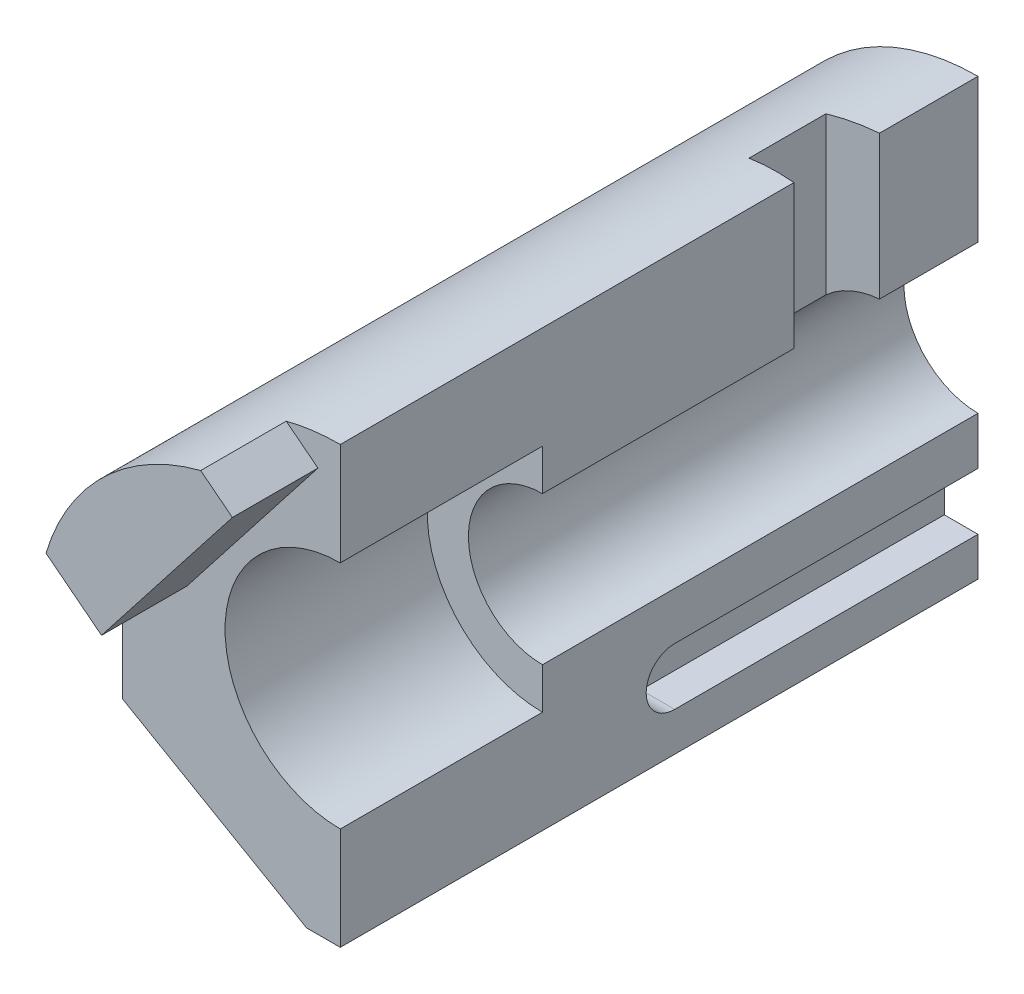
ISO-10303-21;
HEADER;
FILE_DESCRIPTION(('STEP AP214'),'2;1');
FILE_NAME('part.step','',(''),(''),'','','');
FILE_SCHEMA(('AUTOMOTIVE_DESIGN { 1 0 10303 214 1 1 1 1 }'));
ENDSEC;
DATA;
#1=APPLICATION_CONTEXT('core data for automotive mechanical design processes');
#2=APPLICATION_PROTOCOL_DEFINITION('international standard','automotive_design',2000,#1);
#3=PRODUCT_CONTEXT('',#1,'mechanical');
#4=PRODUCT('Part','Part','',(#3));
#5=PRODUCT_RELATED_PRODUCT_CATEGORY('part','',(#4));
#6=PRODUCT_DEFINITION_FORMATION('','',#4);
#7=PRODUCT_DEFINITION_CONTEXT('part definition',#1,'design');
#8=PRODUCT_DEFINITION('design','',#6,#7);
#9=PRODUCT_DEFINITION_SHAPE('','',#8);
#10=(LENGTH_UNIT() NAMED_UNIT(*) SI_UNIT(.MILLI.,.METRE.));
#11=(NAMED_UNIT(*) PLANE_ANGLE_UNIT() SI_UNIT($,.RADIAN.));
#12=(NAMED_UNIT(*) SI_UNIT($,.STERADIAN.) SOLID_ANGLE_UNIT());
#13=UNCERTAINTY_MEASURE_WITH_UNIT(LENGTH_MEASURE(1.E-05),#10,'distance_accuracy_value','');
#14=(GEOMETRIC_REPRESENTATION_CONTEXT(3) GLOBAL_UNCERTAINTY_ASSIGNED_CONTEXT((#13)) GLOBAL_UNIT_ASSIGNED_CONTEXT((#10,
#11,#12)) REPRESENTATION_CONTEXT('',''));
#15=CARTESIAN_POINT('',(0.,0.,0.));
#16=DIRECTION('',(0.,0.,1.));
#17=DIRECTION('',(1.,0.,0.));
#18=AXIS2_PLACEMENT_3D('',#15,#16,#17);
#19=CARTESIAN_POINT('',(0.,84.,-246.));
#20=DIRECTION('',(1.,0.,0.));
#21=DIRECTION('',(0.,1.,0.));
#22=AXIS2_PLACEMENT_3D('',#19,#20,#21);
#23=PLANE('',#22);
#24=DIRECTION('',(0.,1.,0.));
#25=VECTOR('',#24,1.);
#26=CARTESIAN_POINT('',(0.,-84.001,-175.));
#27=LINE('',#26,#25);
#28=CARTESIAN_POINT('',(0.,28.575,-175.));
#29=VERTEX_POINT('',#28);
#30=CARTESIAN_POINT('',(0.,83.9999999999999,-175.));
#31=VERTEX_POINT('',#30);
#32=EDGE_CURVE('E195',#29,#31,#27,.T.);
#33=ORIENTED_EDGE('',*,*,#32,.T.);
#34=DIRECTION('',(0.,0.,1.));
#35=VECTOR('',#34,1.);
#36=CARTESIAN_POINT('',(0.,84.,-246.));
#37=LINE('',#36,#35);
#38=CARTESIAN_POINT('',(0.,84.,0.));
#39=VERTEX_POINT('',#38);
#40=EDGE_CURVE('E404',#31,#39,#37,.T.);
#41=ORIENTED_EDGE('',*,*,#40,.T.);
#42=DIRECTION('',(0.,1.,0.));
#43=VECTOR('',#42,1.);
#44=CARTESIAN_POINT('',(0.,84.,0.));
#45=LINE('',#44,#43);
#46=CARTESIAN_POINT('',(0.,44.45,0.));
#47=VERTEX_POINT('',#46);
#48=EDGE_CURVE('E331',#47,#39,#45,.T.);
#49=ORIENTED_EDGE('',*,*,#48,.F.);
#50=DIRECTION('',(0.,0.,1.));
#51=VECTOR('',#50,1.);
#52=CARTESIAN_POINT('',(0.,44.45,-78.));
#53=LINE('',#52,#51);
#54=CARTESIAN_POINT('',(0.,44.45,-78.));
#55=VERTEX_POINT('',#54);
#56=EDGE_CURVE('E322',#55,#47,#53,.T.);
#57=ORIENTED_EDGE('',*,*,#56,.F.);
#58=DIRECTION('',(0.,-1.,0.));
#59=VECTOR('',#58,1.);
#60=CARTESIAN_POINT('',(0.,44.45,-78.));
#61=LINE('',#60,#59);
#62=CARTESIAN_POINT('',(0.,28.575,-78.));
#63=VERTEX_POINT('',#62);
#64=EDGE_CURVE('E306',#55,#63,#61,.T.);
#65=ORIENTED_EDGE('',*,*,#64,.T.);
#66=DIRECTION('',(0.,0.,1.));
#67=VECTOR('',#66,1.);
#68=CARTESIAN_POINT('',(0.,28.575,-246.));
#69=LINE('',#68,#67);
#70=EDGE_CURVE('E362',#29,#63,#69,.T.);
#71=ORIENTED_EDGE('',*,*,#70,.F.);
#72=EDGE_LOOP('',(#33,#41,#49,#57,#65,#71));
#73=FACE_BOUND('',#72,.T.);
#74=ADVANCED_FACE('F43',(#73),#23,.T.);
#75=CARTESIAN_POINT('',(0.,0.,-246.));
#76=DIRECTION('',(0.,0.,1.));
#77=DIRECTION('',(1.,0.,0.));
#78=AXIS2_PLACEMENT_3D('',#75,#76,#77);
#79=CYLINDRICAL_SURFACE('',#78,28.575);
#80=CARTESIAN_POINT('',(0.,0.,-175.));
#81=DIRECTION('',(-0.0871557427476508,0.,0.996194698091746));
#82=DIRECTION('',(0.996194698091746,0.,0.0871557427476508));
#83=AXIS2_PLACEMENT_3D('',#80,#81,#82);
#84=ELLIPSE('',#83,28.6841518578011,28.575);
#85=CARTESIAN_POINT('',(-19.,21.3431634253219,-176.662284606992));
#86=VERTEX_POINT('',#85);
#87=EDGE_CURVE('E189',#86,#29,#84,.F.);
#88=ORIENTED_EDGE('',*,*,#87,.T.);
#89=ORIENTED_EDGE('',*,*,#70,.T.);
#90=CARTESIAN_POINT('',(0.,0.,-78.));
#91=DIRECTION('',(0.,0.,1.));
#92=DIRECTION('',(1.,0.,0.));
#93=AXIS2_PLACEMENT_3D('',#90,#91,#92);
#94=CIRCLE('',#93,28.575);
#95=CARTESIAN_POINT('',(0.,-28.575,-78.));
#96=VERTEX_POINT('',#95);
#97=EDGE_CURVE('E310',#63,#96,#94,.T.);
#98=ORIENTED_EDGE('',*,*,#97,.T.);
#99=DIRECTION('',(0.,0.,1.));
#100=VECTOR('',#99,1.);
#101=CARTESIAN_POINT('',(0.,-28.575,-246.));
#102=LINE('',#101,#100);
#103=CARTESIAN_POINT('',(0.,-28.575,-246.));
#104=VERTEX_POINT('',#103);
#105=EDGE_CURVE('E52',#104,#96,#102,.T.);
#106=ORIENTED_EDGE('',*,*,#105,.F.);
#107=CARTESIAN_POINT('',(0.,0.,-246.));
#108=DIRECTION('',(0.,0.,-1.));
#109=DIRECTION('',(1.,0.,0.));
#110=AXIS2_PLACEMENT_3D('',#107,#108,#109);
#111=CIRCLE('',#110,28.575);
#112=CARTESIAN_POINT('',(0.,28.575,-246.));
#113=VERTEX_POINT('',#112);
#114=EDGE_CURVE('E332',#104,#113,#111,.T.);
#115=ORIENTED_EDGE('',*,*,#114,.T.);
#116=CARTESIAN_POINT('',(0.,28.575,-208.));
#117=VERTEX_POINT('',#116);
#118=EDGE_CURVE('E405',#113,#117,#69,.T.);
#119=ORIENTED_EDGE('',*,*,#118,.T.);
#120=CARTESIAN_POINT('',(0.,0.,-208.));
#121=DIRECTION('',(-0.087155742747658,0.,-0.996194698091746));
#122=DIRECTION('',(-0.996194698091746,0.,0.087155742747658));
#123=AXIS2_PLACEMENT_3D('',#120,#121,#122);
#124=ELLIPSE('',#123,28.6841518578012,28.575);
#125=CARTESIAN_POINT('',(-19.,21.3431634253219,-206.337715393007));
#126=VERTEX_POINT('',#125);
#127=EDGE_CURVE('E59',#117,#126,#124,.F.);
#128=ORIENTED_EDGE('',*,*,#127,.T.);
#129=DIRECTION('',(0.,0.,1.));
#130=VECTOR('',#129,1.);
#131=CARTESIAN_POINT('',(-19.,21.3431634253219,-246.));
#132=LINE('',#131,#130);
#133=EDGE_CURVE('E204',#126,#86,#132,.T.);
#134=ORIENTED_EDGE('',*,*,#133,.T.);
#135=EDGE_LOOP('',(#88,#89,#98,#106,#115,#119,#128,#134));
#136=FACE_BOUND('',#135,.T.);
#137=ADVANCED_FACE('F45',(#136),#79,.F.);
#138=CARTESIAN_POINT('',(0.,-28.575,-246.));
#139=DIRECTION('',(1.,0.,0.));
#140=DIRECTION('',(0.,1.,0.));
#141=AXIS2_PLACEMENT_3D('',#138,#139,#140);
#142=PLANE('',#141);
#143=DIRECTION('',(0.,0.,-1.));
#144=VECTOR('',#143,1.);
#145=CARTESIAN_POINT('',(0.,-69.,-129.));
#146=LINE('',#145,#144);
#147=CARTESIAN_POINT('',(0.,-69.,-129.));
#148=VERTEX_POINT('',#147);
#149=CARTESIAN_POINT('',(0.,-69.,-246.));
#150=VERTEX_POINT('',#149);
#151=EDGE_CURVE('E233',#148,#150,#146,.T.);
#152=ORIENTED_EDGE('',*,*,#151,.F.);
#153=CARTESIAN_POINT('',(0.,-58.,-129.));
#154=DIRECTION('',(1.,0.,0.));
#155=DIRECTION('',(0.,1.,0.));
#156=AXIS2_PLACEMENT_3D('',#153,#154,#155);
#157=CIRCLE('',#156,11.);
#158=CARTESIAN_POINT('',(0.,-47.,-129.));
#159=VERTEX_POINT('',#158);
#160=EDGE_CURVE('E246',#159,#148,#157,.T.);
#161=ORIENTED_EDGE('',*,*,#160,.F.);
#162=DIRECTION('',(0.,0.,1.));
#163=VECTOR('',#162,1.);
#164=CARTESIAN_POINT('',(0.,-47.,-246.));
#165=LINE('',#164,#163);
#166=CARTESIAN_POINT('',(0.,-47.,-246.));
#167=VERTEX_POINT('',#166);
#168=EDGE_CURVE('E228',#167,#159,#165,.T.);
#169=ORIENTED_EDGE('',*,*,#168,.F.);
#170=DIRECTION('',(0.,1.,0.));
#171=VECTOR('',#170,1.);
#172=CARTESIAN_POINT('',(0.,-28.575,-246.));
#173=LINE('',#172,#171);
#174=EDGE_CURVE('E357',#167,#104,#173,.T.);
#175=ORIENTED_EDGE('',*,*,#174,.T.);
#176=ORIENTED_EDGE('',*,*,#105,.T.);
#177=DIRECTION('',(0.,-1.,0.));
#178=VECTOR('',#177,1.);
#179=CARTESIAN_POINT('',(0.,-28.575,-78.));
#180=LINE('',#179,#178);
#181=CARTESIAN_POINT('',(0.,-44.45,-78.));
#182=VERTEX_POINT('',#181);
#183=EDGE_CURVE('E314',#96,#182,#180,.T.);
#184=ORIENTED_EDGE('',*,*,#183,.T.);
#185=DIRECTION('',(0.,0.,1.));
#186=VECTOR('',#185,1.);
#187=CARTESIAN_POINT('',(0.,-44.45,-78.));
#188=LINE('',#187,#186);
#189=CARTESIAN_POINT('',(0.,-44.45,0.));
#190=VERTEX_POINT('',#189);
#191=EDGE_CURVE('E327',#182,#190,#188,.T.);
#192=ORIENTED_EDGE('',*,*,#191,.T.);
#193=DIRECTION('',(0.,1.,0.));
#194=VECTOR('',#193,1.);
#195=CARTESIAN_POINT('',(0.,-28.575,0.));
#196=LINE('',#195,#194);
#197=CARTESIAN_POINT('',(0.,-84.,0.));
#198=VERTEX_POINT('',#197);
#199=EDGE_CURVE('E337',#198,#190,#196,.T.);
#200=ORIENTED_EDGE('',*,*,#199,.F.);
#201=DIRECTION('',(0.,0.,1.));
#202=VECTOR('',#201,1.);
#203=CARTESIAN_POINT('',(0.,-84.,-246.));
#204=LINE('',#203,#202);
#205=CARTESIAN_POINT('',(0.,-84.,-246.));
#206=VERTEX_POINT('',#205);
#207=EDGE_CURVE('E388',#206,#198,#204,.T.);
#208=ORIENTED_EDGE('',*,*,#207,.F.);
#209=EDGE_CURVE('E358',#206,#150,#173,.T.);
#210=ORIENTED_EDGE('',*,*,#209,.T.);
#211=EDGE_LOOP('',(#152,#161,#169,#175,#176,#184,#192,#200,#208,#210));
#212=FACE_BOUND('',#211,.T.);
#213=ADVANCED_FACE('F427',(#212),#142,.T.);
#214=CARTESIAN_POINT('',(0.,-84.,-246.));
#215=DIRECTION('',(0.,-1.,0.));
#216=DIRECTION('',(0.,0.,-1.));
#217=AXIS2_PLACEMENT_3D('',#214,#215,#216);
#218=PLANE('',#217);
#219=DIRECTION('',(1.,0.,0.));
#220=VECTOR('',#219,1.);
#221=CARTESIAN_POINT('',(0.,-84.,0.));
#222=LINE('',#221,#220);
#223=CARTESIAN_POINT('',(-13.,-84.,0.));
#224=VERTEX_POINT('',#223);
#225=EDGE_CURVE('E378',#224,#198,#222,.T.);
#226=ORIENTED_EDGE('',*,*,#225,.F.);
#227=DIRECTION('',(0.,0.,1.));
#228=VECTOR('',#227,1.);
#229=CARTESIAN_POINT('',(-13.,-84.,-246.));
#230=LINE('',#229,#228);
#231=CARTESIAN_POINT('',(-13.,-84.,-246.));
#232=VERTEX_POINT('',#231);
#233=EDGE_CURVE('E391',#232,#224,#230,.T.);
#234=ORIENTED_EDGE('',*,*,#233,.F.);
#235=DIRECTION('',(1.,0.,0.));
#236=VECTOR('',#235,1.);
#237=CARTESIAN_POINT('',(0.,-84.,-246.));
#238=LINE('',#237,#236);
#239=EDGE_CURVE('E353',#232,#206,#238,.T.);
#240=ORIENTED_EDGE('',*,*,#239,.T.);
#241=ORIENTED_EDGE('',*,*,#207,.T.);
#242=EDGE_LOOP('',(#226,#234,#240,#241));
#243=FACE_BOUND('',#242,.T.);
#244=ADVANCED_FACE('F470',(#243),#218,.T.);
#245=CARTESIAN_POINT('',(-13.,-84.,-246.));
#246=DIRECTION('',(-0.500000000000001,-0.866025403784438,0.));
#247=DIRECTION('',(0.866025403784438,-0.500000000000001,0.));
#248=AXIS2_PLACEMENT_3D('',#245,#246,#247);
#249=PLANE('',#248);
#250=DIRECTION('',(0.866025403784438,-0.500000000000001,0.));
#251=VECTOR('',#250,1.);
#252=CARTESIAN_POINT('',(-13.,-84.,0.));
#253=LINE('',#252,#251);
#254=CARTESIAN_POINT('',(-84.,-43.0081308875365,0.));
#255=VERTEX_POINT('',#254);
#256=EDGE_CURVE('E374',#255,#224,#253,.T.);
#257=ORIENTED_EDGE('',*,*,#256,.F.);
#258=DIRECTION('',(0.,0.,1.));
#259=VECTOR('',#258,1.);
#260=CARTESIAN_POINT('',(-84.,-43.0081308875365,-246.));
#261=LINE('',#260,#259);
#262=CARTESIAN_POINT('',(-84.,-43.0081308875365,-246.));
#263=VERTEX_POINT('',#262);
#264=EDGE_CURVE('E394',#263,#255,#261,.T.);
#265=ORIENTED_EDGE('',*,*,#264,.F.);
#266=DIRECTION('',(0.866025403784438,-0.500000000000001,0.));
#267=VECTOR('',#266,1.);
#268=CARTESIAN_POINT('',(-13.,-84.,-246.));
#269=LINE('',#268,#267);
#270=EDGE_CURVE('E349',#263,#232,#269,.T.);
#271=ORIENTED_EDGE('',*,*,#270,.T.);
#272=ORIENTED_EDGE('',*,*,#233,.T.);
#273=EDGE_LOOP('',(#257,#265,#271,#272));
#274=FACE_BOUND('',#273,.T.);
#275=ADVANCED_FACE('F467',(#274),#249,.T.);
#276=CARTESIAN_POINT('',(-84.,-43.0081308875365,-246.));
#277=DIRECTION('',(-1.,0.,0.));
#278=DIRECTION('',(0.,0.,1.));
#279=AXIS2_PLACEMENT_3D('',#276,#277,#278);
#280=PLANE('',#279);
#281=DIRECTION('',(0.,-1.,0.));
#282=VECTOR('',#281,1.);
#283=CARTESIAN_POINT('',(-84.,-43.0081308875365,0.));
#284=LINE('',#283,#282);
#285=CARTESIAN_POINT('',(-84.,0.,0.));
#286=VERTEX_POINT('',#285);
#287=EDGE_CURVE('E370',#286,#255,#284,.T.);
#288=ORIENTED_EDGE('',*,*,#287,.F.);
#289=DIRECTION('',(0.,0.,1.));
#290=VECTOR('',#289,1.);
#291=CARTESIAN_POINT('',(-84.,0.,-246.));
#292=LINE('',#291,#290);
#293=CARTESIAN_POINT('',(-84.,0.,-246.));
#294=VERTEX_POINT('',#293);
#295=EDGE_CURVE('E397',#294,#286,#292,.T.);
#296=ORIENTED_EDGE('',*,*,#295,.F.);
#297=DIRECTION('',(0.,-1.,0.));
#298=VECTOR('',#297,1.);
#299=CARTESIAN_POINT('',(-84.,-43.0081308875365,-246.));
#300=LINE('',#299,#298);
#301=EDGE_CURVE('E345',#294,#263,#300,.T.);
#302=ORIENTED_EDGE('',*,*,#301,.T.);
#303=ORIENTED_EDGE('',*,*,#264,.T.);
#304=EDGE_LOOP('',(#288,#296,#302,#303));
#305=FACE_BOUND('',#304,.T.);
#306=ADVANCED_FACE('F464',(#305),#280,.T.);
#307=CARTESIAN_POINT('',(0.,0.,-246.));
#308=DIRECTION('',(0.,0.,1.));
#309=DIRECTION('',(1.,0.,0.));
#310=AXIS2_PLACEMENT_3D('',#307,#308,#309);
#311=CYLINDRICAL_SURFACE('',#310,84.);
#312=CARTESIAN_POINT('',(0.,0.,-175.));
#313=DIRECTION('',(-0.0871557427476508,0.,0.996194698091746));
#314=DIRECTION('',(0.996194698091746,0.,0.0871557427476508));
#315=AXIS2_PLACEMENT_3D('',#312,#313,#314);
#316=ELLIPSE('',#315,84.3208663536411,84.);
#317=CARTESIAN_POINT('',(-19.,81.8229796573065,-176.662284606992));
#318=VERTEX_POINT('',#317);
#319=EDGE_CURVE('E225',#318,#31,#316,.F.);
#320=ORIENTED_EDGE('',*,*,#319,.F.);
#321=DIRECTION('',(0.,0.,1.));
#322=VECTOR('',#321,1.);
#323=CARTESIAN_POINT('',(-19.,81.8229796573065,-246.));
#324=LINE('',#323,#322);
#325=CARTESIAN_POINT('',(-19.,81.8229796573065,-206.337715393007));
#326=VERTEX_POINT('',#325);
#327=EDGE_CURVE('E11',#326,#318,#324,.T.);
#328=ORIENTED_EDGE('',*,*,#327,.F.);
#329=CARTESIAN_POINT('',(0.,0.,-208.));
#330=DIRECTION('',(-0.087155742747658,0.,-0.996194698091746));
#331=DIRECTION('',(-0.996194698091746,0.,0.087155742747658));
#332=AXIS2_PLACEMENT_3D('',#329,#330,#331);
#333=ELLIPSE('',#332,84.3208663536412,84.);
#334=CARTESIAN_POINT('',(0.,83.9999999999999,-208.));
#335=VERTEX_POINT('',#334);
#336=EDGE_CURVE('E218',#335,#326,#333,.F.);
#337=ORIENTED_EDGE('',*,*,#336,.F.);
#338=CARTESIAN_POINT('',(0.,84.,-246.));
#339=VERTEX_POINT('',#338);
#340=EDGE_CURVE('E401',#339,#335,#37,.T.);
#341=ORIENTED_EDGE('',*,*,#340,.F.);
#342=CARTESIAN_POINT('',(0.,0.,-246.));
#343=DIRECTION('',(0.,0.,1.));
#344=DIRECTION('',(-1.,0.,0.));
#345=AXIS2_PLACEMENT_3D('',#342,#343,#344);
#346=CIRCLE('',#345,84.);
#347=EDGE_CURVE('E341',#339,#294,#346,.T.);
#348=ORIENTED_EDGE('',*,*,#347,.T.);
#349=ORIENTED_EDGE('',*,*,#295,.T.);
#350=CARTESIAN_POINT('',(0.,0.,0.));
#351=DIRECTION('',(0.,0.,1.));
#352=DIRECTION('',(-1.,0.,0.));
#353=AXIS2_PLACEMENT_3D('',#350,#351,#352);
#354=CIRCLE('',#353,84.);
#355=CARTESIAN_POINT('',(-80.5207393051071,23.9251027533631,0.));
#356=VERTEX_POINT('',#355);
#357=EDGE_CURVE('E366',#356,#286,#354,.T.);
#358=ORIENTED_EDGE('',*,*,#357,.F.);
#359=DIRECTION('',(0.,0.,-1.));
#360=VECTOR('',#359,1.);
#361=CARTESIAN_POINT('',(-80.5207393051071,23.9251027533631,33.));
#362=LINE('',#361,#360);
#363=CARTESIAN_POINT('',(-80.5207393051071,23.9251027533631,33.));
#364=VERTEX_POINT('',#363);
#365=EDGE_CURVE('E301',#364,#356,#362,.T.);
#366=ORIENTED_EDGE('',*,*,#365,.F.);
#367=CARTESIAN_POINT('',(0.,0.,33.));
#368=DIRECTION('',(0.,0.,1.));
#369=DIRECTION('',(1.,0.,0.));
#370=AXIS2_PLACEMENT_3D('',#367,#368,#369);
#371=CIRCLE('',#370,84.);
#372=CARTESIAN_POINT('',(-20.856290899057,81.3696204362163,33.));
#373=VERTEX_POINT('',#372);
#374=EDGE_CURVE('E265',#373,#364,#371,.T.);
#375=ORIENTED_EDGE('',*,*,#374,.F.);
#376=DIRECTION('',(0.,0.,-1.));
#377=VECTOR('',#376,1.);
#378=CARTESIAN_POINT('',(-20.856290899057,81.3696204362163,33.));
#379=LINE('',#378,#377);
#380=CARTESIAN_POINT('',(-20.856290899057,81.3696204362163,0.));
#381=VERTEX_POINT('',#380);
#382=EDGE_CURVE('E279',#373,#381,#379,.T.);
#383=ORIENTED_EDGE('',*,*,#382,.T.);
#384=EDGE_CURVE('E367',#39,#381,#354,.T.);
#385=ORIENTED_EDGE('',*,*,#384,.F.);
#386=ORIENTED_EDGE('',*,*,#40,.F.);
#387=EDGE_LOOP('',(#320,#328,#337,#341,#348,#349,#358,#366,#375,#383,#385,#386));
#388=FACE_BOUND('',#387,.T.);
#389=ADVANCED_FACE('F443',(#388),#311,.T.);
#390=DIRECTION('',(0.,1.,0.));
#391=VECTOR('',#390,1.);
#392=CARTESIAN_POINT('',(0.,-84.001,-208.));
#393=LINE('',#392,#391);
#394=EDGE_CURVE('E214',#117,#335,#393,.T.);
#395=ORIENTED_EDGE('',*,*,#394,.F.);
#396=ORIENTED_EDGE('',*,*,#118,.F.);
#397=DIRECTION('',(0.,1.,0.));
#398=VECTOR('',#397,1.);
#399=CARTESIAN_POINT('',(0.,84.,-246.));
#400=LINE('',#399,#398);
#401=EDGE_CURVE('E336',#113,#339,#400,.T.);
#402=ORIENTED_EDGE('',*,*,#401,.T.);
#403=ORIENTED_EDGE('',*,*,#340,.T.);
#404=EDGE_LOOP('',(#395,#396,#402,#403));
#405=FACE_BOUND('',#404,.T.);
#406=ADVANCED_FACE('F439',(#405),#23,.T.);
#407=CARTESIAN_POINT('',(0.,0.,-246.));
#408=DIRECTION('',(0.,0.,1.));
#409=DIRECTION('',(1.,0.,0.));
#410=AXIS2_PLACEMENT_3D('',#407,#408,#409);
#411=PLANE('',#410);
#412=DIRECTION('',(0.,1.,0.));
#413=VECTOR('',#412,1.);
#414=CARTESIAN_POINT('',(-13.,-47.,-246.));
#415=LINE('',#414,#413);
#416=CARTESIAN_POINT('',(-13.,-69.,-246.));
#417=VERTEX_POINT('',#416);
#418=CARTESIAN_POINT('',(-13.,-47.,-246.));
#419=VERTEX_POINT('',#418);
#420=EDGE_CURVE('E229',#417,#419,#415,.T.);
#421=ORIENTED_EDGE('',*,*,#420,.F.);
#422=DIRECTION('',(1.,0.,0.));
#423=VECTOR('',#422,1.);
#424=CARTESIAN_POINT('',(-13.,-69.,-246.));
#425=LINE('',#424,#423);
#426=EDGE_CURVE('E252',#417,#150,#425,.T.);
#427=ORIENTED_EDGE('',*,*,#426,.T.);
#428=ORIENTED_EDGE('',*,*,#209,.F.);
#429=ORIENTED_EDGE('',*,*,#239,.F.);
#430=ORIENTED_EDGE('',*,*,#270,.F.);
#431=ORIENTED_EDGE('',*,*,#301,.F.);
#432=ORIENTED_EDGE('',*,*,#347,.F.);
#433=ORIENTED_EDGE('',*,*,#401,.F.);
#434=ORIENTED_EDGE('',*,*,#114,.F.);
#435=ORIENTED_EDGE('',*,*,#174,.F.);
#436=DIRECTION('',(1.,0.,0.));
#437=VECTOR('',#436,1.);
#438=CARTESIAN_POINT('',(-13.,-47.,-246.));
#439=LINE('',#438,#437);
#440=EDGE_CURVE('E242',#419,#167,#439,.T.);
#441=ORIENTED_EDGE('',*,*,#440,.F.);
#442=EDGE_LOOP('',(#421,#427,#428,#429,#430,#431,#432,#433,#434,#435,#441));
#443=FACE_BOUND('',#442,.T.);
#444=ADVANCED_FACE('F434',(#443),#411,.F.);
#445=CARTESIAN_POINT('',(0.,0.,0.));
#446=DIRECTION('',(0.,0.,1.));
#447=DIRECTION('',(1.,0.,0.));
#448=AXIS2_PLACEMENT_3D('',#445,#446,#447);
#449=PLANE('',#448);
#450=DIRECTION('',(-0.788010753606721,0.615661475325659,0.));
#451=VECTOR('',#450,1.);
#452=CARTESIAN_POINT('',(-20.856290899057,81.3696204362163,0.));
#453=LINE('',#452,#451);
#454=CARTESIAN_POINT('',(-8.61759968975226,71.8077069071324,0.));
#455=VERTEX_POINT('',#454);
#456=EDGE_CURVE('E270',#455,#381,#453,.T.);
#457=ORIENTED_EDGE('',*,*,#456,.F.);
#458=DIRECTION('',(0.615661475325653,0.788010753606726,0.));
#459=VECTOR('',#458,1.);
#460=CARTESIAN_POINT('',(-8.61759968975226,71.8077069071324,0.));
#461=LINE('',#460,#459);
#462=CARTESIAN_POINT('',(-59.1018406664558,7.19082511138085,0.));
#463=VERTEX_POINT('',#462);
#464=EDGE_CURVE('E283',#463,#455,#461,.T.);
#465=ORIENTED_EDGE('',*,*,#464,.F.);
#466=DIRECTION('',(0.788010753606726,-0.615661475325653,0.));
#467=VECTOR('',#466,1.);
#468=CARTESIAN_POINT('',(-59.1018406664558,7.19082511138085,0.));
#469=LINE('',#468,#467);
#470=EDGE_CURVE('E256',#356,#463,#469,.T.);
#471=ORIENTED_EDGE('',*,*,#470,.F.);
#472=ORIENTED_EDGE('',*,*,#357,.T.);
#473=ORIENTED_EDGE('',*,*,#287,.T.);
#474=ORIENTED_EDGE('',*,*,#256,.T.);
#475=ORIENTED_EDGE('',*,*,#225,.T.);
#476=ORIENTED_EDGE('',*,*,#199,.T.);
#477=CARTESIAN_POINT('',(0.,0.,0.));
#478=DIRECTION('',(0.,0.,1.));
#479=DIRECTION('',(1.,0.,0.));
#480=AXIS2_PLACEMENT_3D('',#477,#478,#479);
#481=CIRCLE('',#480,44.45);
#482=EDGE_CURVE('E305',#47,#190,#481,.T.);
#483=ORIENTED_EDGE('',*,*,#482,.F.);
#484=ORIENTED_EDGE('',*,*,#48,.T.);
#485=ORIENTED_EDGE('',*,*,#384,.T.);
#486=EDGE_LOOP('',(#457,#465,#471,#472,#473,#474,#475,#476,#483,#484,#485));
#487=FACE_BOUND('',#486,.T.);
#488=ADVANCED_FACE('F421',(#487),#449,.T.);
#489=CARTESIAN_POINT('',(0.,0.,-78.));
#490=DIRECTION('',(0.,0.,1.));
#491=DIRECTION('',(1.,0.,0.));
#492=AXIS2_PLACEMENT_3D('',#489,#490,#491);
#493=CYLINDRICAL_SURFACE('',#492,44.45);
#494=ORIENTED_EDGE('',*,*,#482,.T.);
#495=ORIENTED_EDGE('',*,*,#191,.F.);
#496=CARTESIAN_POINT('',(0.,0.,-78.));
#497=DIRECTION('',(0.,0.,1.));
#498=DIRECTION('',(1.,0.,0.));
#499=AXIS2_PLACEMENT_3D('',#496,#497,#498);
#500=CIRCLE('',#499,44.45);
#501=EDGE_CURVE('E318',#55,#182,#500,.T.);
#502=ORIENTED_EDGE('',*,*,#501,.F.);
#503=ORIENTED_EDGE('',*,*,#56,.T.);
#504=EDGE_LOOP('',(#494,#495,#502,#503));
#505=FACE_BOUND('',#504,.T.);
#506=ADVANCED_FACE('F419',(#505),#493,.F.);
#507=CARTESIAN_POINT('',(0.,0.,-78.));
#508=DIRECTION('',(0.,0.,1.));
#509=DIRECTION('',(1.,0.,0.));
#510=AXIS2_PLACEMENT_3D('',#507,#508,#509);
#511=PLANE('',#510);
#512=ORIENTED_EDGE('',*,*,#64,.F.);
#513=ORIENTED_EDGE('',*,*,#501,.T.);
#514=ORIENTED_EDGE('',*,*,#183,.F.);
#515=ORIENTED_EDGE('',*,*,#97,.F.);
#516=EDGE_LOOP('',(#512,#513,#514,#515));
#517=FACE_BOUND('',#516,.T.);
#518=ADVANCED_FACE('F413',(#517),#511,.T.);
#519=CARTESIAN_POINT('',(-59.1018406664558,7.19082511138085,33.));
#520=DIRECTION('',(0.615661475325653,0.788010753606726,0.));
#521=DIRECTION('',(-0.788010753606726,0.615661475325653,0.));
#522=AXIS2_PLACEMENT_3D('',#519,#520,#521);
#523=PLANE('',#522);
#524=ORIENTED_EDGE('',*,*,#470,.T.);
#525=DIRECTION('',(0.,0.,-1.));
#526=VECTOR('',#525,1.);
#527=CARTESIAN_POINT('',(-59.1018406664558,7.19082511138085,33.));
#528=LINE('',#527,#526);
#529=CARTESIAN_POINT('',(-59.1018406664558,7.19082511138085,33.));
#530=VERTEX_POINT('',#529);
#531=EDGE_CURVE('E297',#530,#463,#528,.T.);
#532=ORIENTED_EDGE('',*,*,#531,.F.);
#533=DIRECTION('',(0.788010753606726,-0.615661475325653,0.));
#534=VECTOR('',#533,1.);
#535=CARTESIAN_POINT('',(-59.1018406664558,7.19082511138085,33.));
#536=LINE('',#535,#534);
#537=EDGE_CURVE('E269',#364,#530,#536,.T.);
#538=ORIENTED_EDGE('',*,*,#537,.F.);
#539=ORIENTED_EDGE('',*,*,#365,.T.);
#540=EDGE_LOOP('',(#524,#532,#538,#539));
#541=FACE_BOUND('',#540,.T.);
#542=ADVANCED_FACE('F457',(#541),#523,.F.);
#543=CARTESIAN_POINT('',(-8.61759968975226,71.8077069071324,33.));
#544=DIRECTION('',(-0.788010753606726,0.615661475325653,0.));
#545=DIRECTION('',(-0.615661475325653,-0.788010753606726,0.));
#546=AXIS2_PLACEMENT_3D('',#543,#544,#545);
#547=PLANE('',#546);
#548=ORIENTED_EDGE('',*,*,#464,.T.);
#549=DIRECTION('',(0.,0.,-1.));
#550=VECTOR('',#549,1.);
#551=CARTESIAN_POINT('',(-8.61759968975226,71.8077069071324,33.));
#552=LINE('',#551,#550);
#553=CARTESIAN_POINT('',(-8.61759968975226,71.8077069071324,33.));
#554=VERTEX_POINT('',#553);
#555=EDGE_CURVE('E293',#554,#455,#552,.T.);
#556=ORIENTED_EDGE('',*,*,#555,.F.);
#557=DIRECTION('',(0.615661475325653,0.788010753606726,0.));
#558=VECTOR('',#557,1.);
#559=CARTESIAN_POINT('',(-8.61759968975226,71.8077069071324,33.));
#560=LINE('',#559,#558);
#561=EDGE_CURVE('E273',#530,#554,#560,.T.);
#562=ORIENTED_EDGE('',*,*,#561,.F.);
#563=ORIENTED_EDGE('',*,*,#531,.T.);
#564=EDGE_LOOP('',(#548,#556,#562,#563));
#565=FACE_BOUND('',#564,.T.);
#566=ADVANCED_FACE('F453',(#565),#547,.F.);
#567=CARTESIAN_POINT('',(-20.856290899057,81.3696204362163,33.));
#568=DIRECTION('',(-0.615661475325659,-0.788010753606721,0.));
#569=DIRECTION('',(0.788010753606721,-0.61566147532566,0.));
#570=AXIS2_PLACEMENT_3D('',#567,#568,#569);
#571=PLANE('',#570);
#572=ORIENTED_EDGE('',*,*,#456,.T.);
#573=ORIENTED_EDGE('',*,*,#382,.F.);
#574=DIRECTION('',(-0.788010753606721,0.615661475325659,0.));
#575=VECTOR('',#574,1.);
#576=CARTESIAN_POINT('',(-20.856290899057,81.3696204362163,33.));
#577=LINE('',#576,#575);
#578=EDGE_CURVE('E276',#554,#373,#577,.T.);
#579=ORIENTED_EDGE('',*,*,#578,.F.);
#580=ORIENTED_EDGE('',*,*,#555,.T.);
#581=EDGE_LOOP('',(#572,#573,#579,#580));
#582=FACE_BOUND('',#581,.T.);
#583=ADVANCED_FACE('F448',(#582),#571,.F.);
#584=CARTESIAN_POINT('',(0.,0.,33.));
#585=DIRECTION('',(0.,0.,1.));
#586=DIRECTION('',(1.,0.,0.));
#587=AXIS2_PLACEMENT_3D('',#584,#585,#586);
#588=PLANE('',#587);
#589=ORIENTED_EDGE('',*,*,#374,.T.);
#590=ORIENTED_EDGE('',*,*,#537,.T.);
#591=ORIENTED_EDGE('',*,*,#561,.T.);
#592=ORIENTED_EDGE('',*,*,#578,.T.);
#593=EDGE_LOOP('',(#589,#590,#591,#592));
#594=FACE_BOUND('',#593,.T.);
#595=ADVANCED_FACE('F525',(#594),#588,.T.);
#596=CARTESIAN_POINT('',(-13.,-69.,-129.));
#597=DIRECTION('',(0.,-1.,0.));
#598=DIRECTION('',(1.,0.,0.));
#599=AXIS2_PLACEMENT_3D('',#596,#597,#598);
#600=PLANE('',#599);
#601=ORIENTED_EDGE('',*,*,#151,.T.);
#602=ORIENTED_EDGE('',*,*,#426,.F.);
#603=DIRECTION('',(0.,0.,-1.));
#604=VECTOR('',#603,1.);
#605=CARTESIAN_POINT('',(-13.,-69.,-129.));
#606=LINE('',#605,#604);
#607=CARTESIAN_POINT('',(-13.,-69.,-129.));
#608=VERTEX_POINT('',#607);
#609=EDGE_CURVE('E67',#608,#417,#606,.T.);
#610=ORIENTED_EDGE('',*,*,#609,.F.);
#611=DIRECTION('',(1.,0.,0.));
#612=VECTOR('',#611,1.);
#613=CARTESIAN_POINT('',(-13.,-69.,-129.));
#614=LINE('',#613,#612);
#615=EDGE_CURVE('E257',#608,#148,#614,.T.);
#616=ORIENTED_EDGE('',*,*,#615,.T.);
#617=EDGE_LOOP('',(#601,#602,#610,#616));
#618=FACE_BOUND('',#617,.T.);
#619=ADVANCED_FACE('F474',(#618),#600,.F.);
#620=CARTESIAN_POINT('',(-13.,-58.,-129.));
#621=DIRECTION('',(1.,0.,0.));
#622=DIRECTION('',(0.,1.,0.));
#623=AXIS2_PLACEMENT_3D('',#620,#621,#622);
#624=CYLINDRICAL_SURFACE('',#623,11.);
#625=ORIENTED_EDGE('',*,*,#160,.T.);
#626=ORIENTED_EDGE('',*,*,#615,.F.);
#627=CARTESIAN_POINT('',(-13.,-58.,-129.));
#628=DIRECTION('',(1.,0.,0.));
#629=DIRECTION('',(0.,1.,0.));
#630=AXIS2_PLACEMENT_3D('',#627,#628,#629);
#631=CIRCLE('',#630,11.);
#632=CARTESIAN_POINT('',(-13.,-47.,-129.));
#633=VERTEX_POINT('',#632);
#634=EDGE_CURVE('E237',#633,#608,#631,.T.);
#635=ORIENTED_EDGE('',*,*,#634,.F.);
#636=DIRECTION('',(1.,0.,0.));
#637=VECTOR('',#636,1.);
#638=CARTESIAN_POINT('',(-13.,-47.,-129.));
#639=LINE('',#638,#637);
#640=EDGE_CURVE('E260',#633,#159,#639,.T.);
#641=ORIENTED_EDGE('',*,*,#640,.T.);
#642=EDGE_LOOP('',(#625,#626,#635,#641));
#643=FACE_BOUND('',#642,.T.);
#644=ADVANCED_FACE('F477',(#643),#624,.F.);
#645=CARTESIAN_POINT('',(-13.,-47.,-246.));
#646=DIRECTION('',(0.,1.,0.));
#647=DIRECTION('',(0.,0.,1.));
#648=AXIS2_PLACEMENT_3D('',#645,#646,#647);
#649=PLANE('',#648);
#650=ORIENTED_EDGE('',*,*,#168,.T.);
#651=ORIENTED_EDGE('',*,*,#640,.F.);
#652=DIRECTION('',(0.,0.,1.));
#653=VECTOR('',#652,1.);
#654=CARTESIAN_POINT('',(-13.,-47.,-246.));
#655=LINE('',#654,#653);
#656=EDGE_CURVE('E232',#419,#633,#655,.T.);
#657=ORIENTED_EDGE('',*,*,#656,.F.);
#658=ORIENTED_EDGE('',*,*,#440,.T.);
#659=EDGE_LOOP('',(#650,#651,#657,#658));
#660=FACE_BOUND('',#659,.T.);
#661=ADVANCED_FACE('F479',(#660),#649,.F.);
#662=CARTESIAN_POINT('',(-13.,-58.,-129.));
#663=DIRECTION('',(1.,0.,0.));
#664=DIRECTION('',(0.,1.,0.));
#665=AXIS2_PLACEMENT_3D('',#662,#663,#664);
#666=PLANE('',#665);
#667=ORIENTED_EDGE('',*,*,#420,.T.);
#668=ORIENTED_EDGE('',*,*,#656,.T.);
#669=ORIENTED_EDGE('',*,*,#634,.T.);
#670=ORIENTED_EDGE('',*,*,#609,.T.);
#671=EDGE_LOOP('',(#667,#668,#669,#670));
#672=FACE_BOUND('',#671,.T.);
#673=ADVANCED_FACE('F480',(#672),#666,.T.);
#674=CARTESIAN_POINT('',(-19.,-84.001,-206.337715393007));
#675=DIRECTION('',(-1.,0.,0.));
#676=DIRECTION('',(0.,0.,1.));
#677=AXIS2_PLACEMENT_3D('',#674,#675,#676);
#678=PLANE('',#677);
#679=ORIENTED_EDGE('',*,*,#327,.T.);
#680=DIRECTION('',(0.,1.,0.));
#681=VECTOR('',#680,1.);
#682=CARTESIAN_POINT('',(-19.,-84.001,-176.662284606992));
#683=LINE('',#682,#681);
#684=EDGE_CURVE('E192',#86,#318,#683,.T.);
#685=ORIENTED_EDGE('',*,*,#684,.F.);
#686=ORIENTED_EDGE('',*,*,#133,.F.);
#687=DIRECTION('',(0.,1.,0.));
#688=VECTOR('',#687,1.);
#689=CARTESIAN_POINT('',(-19.,-84.001,-206.337715393007));
#690=LINE('',#689,#688);
#691=EDGE_CURVE('E213',#126,#326,#690,.T.);
#692=ORIENTED_EDGE('',*,*,#691,.T.);
#693=EDGE_LOOP('',(#679,#685,#686,#692));
#694=FACE_BOUND('',#693,.T.);
#695=ADVANCED_FACE('F202',(#694),#678,.F.);
#696=CARTESIAN_POINT('',(-19.,-84.001,-176.662284606992));
#697=DIRECTION('',(-0.0871557427476508,0.,0.996194698091746));
#698=DIRECTION('',(0.996194698091746,0.,0.0871557427476508));
#699=AXIS2_PLACEMENT_3D('',#696,#697,#698);
#700=PLANE('',#699);
#701=ORIENTED_EDGE('',*,*,#319,.T.);
#702=ORIENTED_EDGE('',*,*,#32,.F.);
#703=ORIENTED_EDGE('',*,*,#87,.F.);
#704=ORIENTED_EDGE('',*,*,#684,.T.);
#705=EDGE_LOOP('',(#701,#702,#703,#704));
#706=FACE_BOUND('',#705,.T.);
#707=ADVANCED_FACE('F191',(#706),#700,.F.);
#708=CARTESIAN_POINT('',(0.,-84.001,-208.));
#709=DIRECTION('',(-0.087155742747658,0.,-0.996194698091746));
#710=DIRECTION('',(-0.996194698091746,0.,0.087155742747658));
#711=AXIS2_PLACEMENT_3D('',#708,#709,#710);
#712=PLANE('',#711);
#713=ORIENTED_EDGE('',*,*,#336,.T.);
#714=ORIENTED_EDGE('',*,*,#691,.F.);
#715=ORIENTED_EDGE('',*,*,#127,.F.);
#716=ORIENTED_EDGE('',*,*,#394,.T.);
#717=EDGE_LOOP('',(#713,#714,#715,#716));
#718=FACE_BOUND('',#717,.T.);
#719=ADVANCED_FACE('F441',(#718),#712,.F.);
#720=CLOSED_SHELL('',(#74,#137,#213,#244,#275,#306,#389,#406,#444,#488,#506,#518,#542,#566,#583,
#595,#619,#644,#661,#673,#695,#707,#719));
#721=MANIFOLD_SOLID_BREP('B2',#720);
#722=ADVANCED_BREP_SHAPE_REPRESENTATION('',(#18,#721),#14);
#723=SHAPE_DEFINITION_REPRESENTATION(#9,#722);
ENDSEC;
END-ISO-10303-21;
